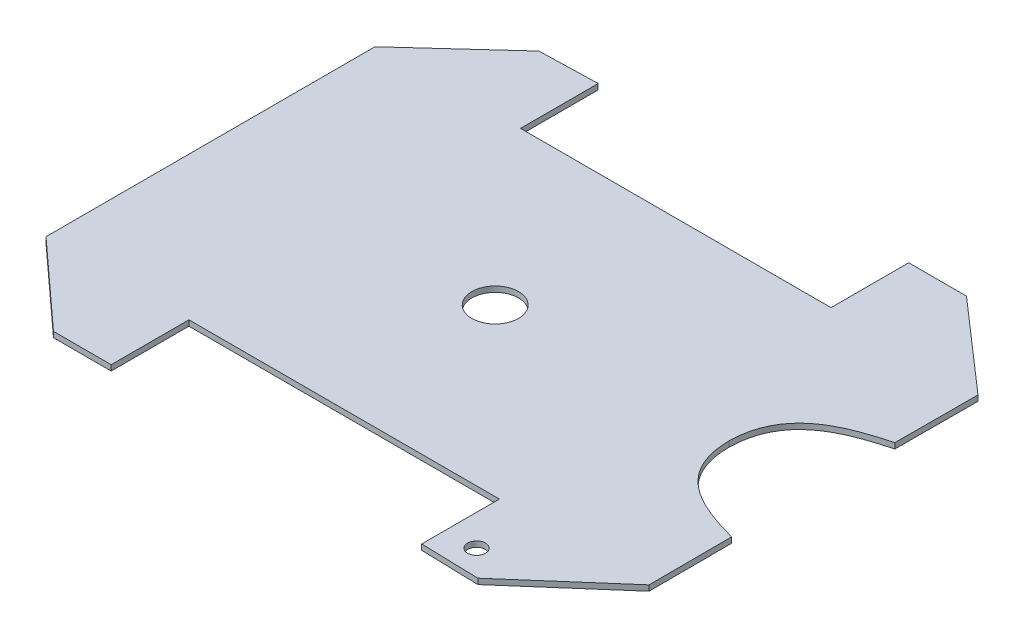
ISO-10303-21;
HEADER;
FILE_DESCRIPTION(('STEP AP214'),'2;1');
FILE_NAME('part.step','',(''),(''),'','','');
FILE_SCHEMA(('AUTOMOTIVE_DESIGN { 1 0 10303 214 1 1 1 1 }'));
ENDSEC;
DATA;
#1=APPLICATION_CONTEXT('core data for automotive mechanical design processes');
#2=APPLICATION_PROTOCOL_DEFINITION('international standard','automotive_design',2000,#1);
#3=PRODUCT_CONTEXT('',#1,'mechanical');
#4=PRODUCT('Part','Part','',(#3));
#5=PRODUCT_RELATED_PRODUCT_CATEGORY('part','',(#4));
#6=PRODUCT_DEFINITION_FORMATION('','',#4);
#7=PRODUCT_DEFINITION_CONTEXT('part definition',#1,'design');
#8=PRODUCT_DEFINITION('design','',#6,#7);
#9=PRODUCT_DEFINITION_SHAPE('','',#8);
#10=(LENGTH_UNIT() NAMED_UNIT(*) SI_UNIT(.MILLI.,.METRE.));
#11=(NAMED_UNIT(*) PLANE_ANGLE_UNIT() SI_UNIT($,.RADIAN.));
#12=(NAMED_UNIT(*) SI_UNIT($,.STERADIAN.) SOLID_ANGLE_UNIT());
#13=UNCERTAINTY_MEASURE_WITH_UNIT(LENGTH_MEASURE(1.E-05),#10,'distance_accuracy_value','');
#14=(GEOMETRIC_REPRESENTATION_CONTEXT(3) GLOBAL_UNCERTAINTY_ASSIGNED_CONTEXT((#13)) GLOBAL_UNIT_ASSIGNED_CONTEXT((#10,
#11,#12)) REPRESENTATION_CONTEXT('',''));
#15=CARTESIAN_POINT('',(0.,0.,0.));
#16=DIRECTION('',(0.,0.,1.));
#17=DIRECTION('',(1.,0.,0.));
#18=AXIS2_PLACEMENT_3D('',#15,#16,#17);
#19=CARTESIAN_POINT('',(273.101729513809,5.,148.382005757265));
#20=CARTESIAN_POINT('',(239.363891716756,5.,139.145872688841));
#21=CARTESIAN_POINT('',(197.437007814589,5.,125.423723422917));
#22=CARTESIAN_POINT('',(197.047353035714,5.,74.8747182026435));
#23=B_SPLINE_CURVE_WITH_KNOTS('',3,(#19,#20,#21,#22),.UNSPECIFIED.,.F.,.F.,(4,4),(0.,1.),.UNSPECIFIED.);
#24=DIRECTION('',(0.,-1.,0.));
#25=VECTOR('',#24,1.);
#26=SURFACE_OF_LINEAR_EXTRUSION('',#23,#25);
#27=CARTESIAN_POINT('',(273.101729513809,0.,148.382005757265));
#28=CARTESIAN_POINT('',(239.363891716756,0.,139.145872688841));
#29=CARTESIAN_POINT('',(197.437007814589,0.,125.423723422917));
#30=CARTESIAN_POINT('',(197.047353035714,0.,74.8747182026435));
#31=B_SPLINE_CURVE_WITH_KNOTS('',3,(#27,#28,#29,#30),.UNSPECIFIED.,.F.,.F.,(4,4),(0.,1.),.UNSPECIFIED.);
#32=CARTESIAN_POINT('',(273.101729513809,0.,148.382005757266));
#33=VERTEX_POINT('',#32);
#34=CARTESIAN_POINT('',(197.047353035714,0.,74.8747182026436));
#35=VERTEX_POINT('',#34);
#36=EDGE_CURVE('E195',#33,#35,#31,.T.);
#37=ORIENTED_EDGE('',*,*,#36,.T.);
#38=DIRECTION('',(0.,-1.,0.));
#39=VECTOR('',#38,1.);
#40=CARTESIAN_POINT('',(197.047353035714,5.,74.8747182026436));
#41=LINE('',#40,#39);
#42=CARTESIAN_POINT('',(197.047353035714,5.,74.8747182026436));
#43=VERTEX_POINT('',#42);
#44=EDGE_CURVE('E11',#43,#35,#41,.T.);
#45=ORIENTED_EDGE('',*,*,#44,.F.);
#46=CARTESIAN_POINT('',(273.101729513809,5.,148.382005757266));
#47=VERTEX_POINT('',#46);
#48=EDGE_CURVE('E242',#47,#43,#23,.T.);
#49=ORIENTED_EDGE('',*,*,#48,.F.);
#50=DIRECTION('',(0.,-1.,0.));
#51=VECTOR('',#50,1.);
#52=CARTESIAN_POINT('',(273.101729513809,5.,148.382005757266));
#53=LINE('',#52,#51);
#54=EDGE_CURVE('E191',#47,#33,#53,.T.);
#55=ORIENTED_EDGE('',*,*,#54,.T.);
#56=EDGE_LOOP('',(#37,#45,#49,#55));
#57=FACE_BOUND('',#56,.T.);
#58=ADVANCED_FACE('F32',(#57),#26,.F.);
#59=CARTESIAN_POINT('',(197.047353035714,5.,74.8747182026436));
#60=CARTESIAN_POINT('',(197.437007814589,5.,24.3257129823706));
#61=CARTESIAN_POINT('',(239.363891716756,5.,10.6035637164465));
#62=CARTESIAN_POINT('',(273.101729513809,5.,1.36743064802208));
#63=B_SPLINE_CURVE_WITH_KNOTS('',3,(#59,#60,#61,#62),.UNSPECIFIED.,.F.,.F.,(4,4),(0.,1.),.UNSPECIFIED.);
#64=DIRECTION('',(0.,-1.,0.));
#65=VECTOR('',#64,1.);
#66=SURFACE_OF_LINEAR_EXTRUSION('',#63,#65);
#67=CARTESIAN_POINT('',(197.047353035714,0.,74.8747182026436));
#68=CARTESIAN_POINT('',(197.437007814589,0.,24.3257129823706));
#69=CARTESIAN_POINT('',(239.363891716756,0.,10.6035637164465));
#70=CARTESIAN_POINT('',(273.101729513809,0.,1.36743064802208));
#71=B_SPLINE_CURVE_WITH_KNOTS('',3,(#67,#68,#69,#70),.UNSPECIFIED.,.F.,.F.,(4,4),(0.,1.),.UNSPECIFIED.);
#72=CARTESIAN_POINT('',(273.101729513809,0.,1.36743064802208));
#73=VERTEX_POINT('',#72);
#74=EDGE_CURVE('E200',#35,#73,#71,.T.);
#75=ORIENTED_EDGE('',*,*,#74,.T.);
#76=DIRECTION('',(0.,-1.,0.));
#77=VECTOR('',#76,1.);
#78=CARTESIAN_POINT('',(273.101729513809,5.,1.36743064802208));
#79=LINE('',#78,#77);
#80=CARTESIAN_POINT('',(273.101729513809,5.,1.36743064802208));
#81=VERTEX_POINT('',#80);
#82=EDGE_CURVE('E41',#81,#73,#79,.T.);
#83=ORIENTED_EDGE('',*,*,#82,.F.);
#84=EDGE_CURVE('E125',#43,#81,#63,.T.);
#85=ORIENTED_EDGE('',*,*,#84,.F.);
#86=ORIENTED_EDGE('',*,*,#44,.T.);
#87=EDGE_LOOP('',(#75,#83,#85,#86));
#88=FACE_BOUND('',#87,.T.);
#89=ADVANCED_FACE('F356',(#88),#66,.F.);
#90=CARTESIAN_POINT('',(273.341577688739,5.,-73.2625755728206));
#91=DIRECTION('',(-0.999994835687422,0.,-0.0032138136980613));
#92=DIRECTION('',(-0.0032138136980613,0.,0.999994835687422));
#93=AXIS2_PLACEMENT_3D('',#90,#91,#92);
#94=PLANE('',#93);
#95=DIRECTION('',(0.0032138136980613,0.,-0.999994835687422));
#96=VECTOR('',#95,1.);
#97=CARTESIAN_POINT('',(273.341577688739,0.,-73.2625755728206));
#98=LINE('',#97,#96);
#99=CARTESIAN_POINT('',(273.341577688739,0.,-73.2625755728206));
#100=VERTEX_POINT('',#99);
#101=EDGE_CURVE('E208',#73,#100,#98,.T.);
#102=ORIENTED_EDGE('',*,*,#101,.T.);
#103=DIRECTION('',(0.,-1.,0.));
#104=VECTOR('',#103,1.);
#105=CARTESIAN_POINT('',(273.341577688739,5.,-73.2625755728206));
#106=LINE('',#105,#104);
#107=CARTESIAN_POINT('',(273.341577688739,5.,-73.2625755728206));
#108=VERTEX_POINT('',#107);
#109=EDGE_CURVE('E282',#108,#100,#106,.T.);
#110=ORIENTED_EDGE('',*,*,#109,.F.);
#111=DIRECTION('',(0.0032138136980613,0.,-0.999994835687422));
#112=VECTOR('',#111,1.);
#113=CARTESIAN_POINT('',(273.341577688739,5.,-73.2625755728206));
#114=LINE('',#113,#112);
#115=EDGE_CURVE('E290',#81,#108,#114,.T.);
#116=ORIENTED_EDGE('',*,*,#115,.F.);
#117=ORIENTED_EDGE('',*,*,#82,.T.);
#118=EDGE_LOOP('',(#102,#110,#116,#117));
#119=FACE_BOUND('',#118,.T.);
#120=ADVANCED_FACE('F288',(#119),#94,.F.);
#121=CARTESIAN_POINT('',(273.341577688739,5.,-73.2625755728206));
#122=DIRECTION('',(-0.657933153115814,0.,0.753076334796867));
#123=DIRECTION('',(0.753076334796867,0.,0.657933153115814));
#124=AXIS2_PLACEMENT_3D('',#121,#122,#123);
#125=PLANE('',#124);
#126=DIRECTION('',(-0.753076334796867,0.,-0.657933153115814));
#127=VECTOR('',#126,1.);
#128=CARTESIAN_POINT('',(273.341577688739,0.,-73.2625755728206));
#129=LINE('',#128,#127);
#130=CARTESIAN_POINT('',(191.068300868454,0.,-145.141499307877));
#131=VERTEX_POINT('',#130);
#132=EDGE_CURVE('E213',#100,#131,#129,.T.);
#133=ORIENTED_EDGE('',*,*,#132,.T.);
#134=DIRECTION('',(0.,-1.,0.));
#135=VECTOR('',#134,1.);
#136=CARTESIAN_POINT('',(191.068300868454,5.,-145.141499307877));
#137=LINE('',#136,#135);
#138=CARTESIAN_POINT('',(191.068300868454,5.,-145.141499307877));
#139=VERTEX_POINT('',#138);
#140=EDGE_CURVE('E279',#139,#131,#137,.T.);
#141=ORIENTED_EDGE('',*,*,#140,.F.);
#142=DIRECTION('',(-0.753076334796867,0.,-0.657933153115814));
#143=VECTOR('',#142,1.);
#144=CARTESIAN_POINT('',(273.341577688739,5.,-73.2625755728206));
#145=LINE('',#144,#143);
#146=EDGE_CURVE('E308',#108,#139,#145,.T.);
#147=ORIENTED_EDGE('',*,*,#146,.F.);
#148=ORIENTED_EDGE('',*,*,#109,.T.);
#149=EDGE_LOOP('',(#133,#141,#147,#148));
#150=FACE_BOUND('',#149,.T.);
#151=ADVANCED_FACE('F299',(#150),#125,.F.);
#152=CARTESIAN_POINT('',(139.068300868454,5.,-145.141499307877));
#153=DIRECTION('',(0.,0.,1.));
#154=DIRECTION('',(1.,0.,0.));
#155=AXIS2_PLACEMENT_3D('',#152,#153,#154);
#156=PLANE('',#155);
#157=DIRECTION('',(-1.,0.,0.));
#158=VECTOR('',#157,1.);
#159=CARTESIAN_POINT('',(139.068300868454,0.,-145.141499307877));
#160=LINE('',#159,#158);
#161=CARTESIAN_POINT('',(139.068300868454,0.,-145.141499307877));
#162=VERTEX_POINT('',#161);
#163=EDGE_CURVE('E215',#131,#162,#160,.T.);
#164=ORIENTED_EDGE('',*,*,#163,.T.);
#165=DIRECTION('',(0.,-1.,0.));
#166=VECTOR('',#165,1.);
#167=CARTESIAN_POINT('',(139.068300868454,5.,-145.141499307877));
#168=LINE('',#167,#166);
#169=CARTESIAN_POINT('',(139.068300868454,5.,-145.141499307877));
#170=VERTEX_POINT('',#169);
#171=EDGE_CURVE('E276',#170,#162,#168,.T.);
#172=ORIENTED_EDGE('',*,*,#171,.F.);
#173=DIRECTION('',(-1.,0.,0.));
#174=VECTOR('',#173,1.);
#175=CARTESIAN_POINT('',(139.068300868454,5.,-145.141499307877));
#176=LINE('',#175,#174);
#177=EDGE_CURVE('E305',#139,#170,#176,.T.);
#178=ORIENTED_EDGE('',*,*,#177,.F.);
#179=ORIENTED_EDGE('',*,*,#140,.T.);
#180=EDGE_LOOP('',(#164,#172,#178,#179));
#181=FACE_BOUND('',#180,.T.);
#182=ADVANCED_FACE('F303',(#181),#156,.F.);
#183=CARTESIAN_POINT('',(139.068300868454,5.,-75.1414993078773));
#184=DIRECTION('',(1.,0.,0.));
#185=DIRECTION('',(0.,0.,-1.));
#186=AXIS2_PLACEMENT_3D('',#183,#184,#185);
#187=PLANE('',#186);
#188=DIRECTION('',(0.,0.,1.));
#189=VECTOR('',#188,1.);
#190=CARTESIAN_POINT('',(139.068300868454,0.,-75.1414993078773));
#191=LINE('',#190,#189);
#192=CARTESIAN_POINT('',(139.068300868454,0.,-75.1414993078773));
#193=VERTEX_POINT('',#192);
#194=EDGE_CURVE('E217',#162,#193,#191,.T.);
#195=ORIENTED_EDGE('',*,*,#194,.T.);
#196=DIRECTION('',(0.,-1.,0.));
#197=VECTOR('',#196,1.);
#198=CARTESIAN_POINT('',(139.068300868454,5.,-75.1414993078773));
#199=LINE('',#198,#197);
#200=CARTESIAN_POINT('',(139.068300868454,5.,-75.1414993078773));
#201=VERTEX_POINT('',#200);
#202=EDGE_CURVE('E273',#201,#193,#199,.T.);
#203=ORIENTED_EDGE('',*,*,#202,.F.);
#204=DIRECTION('',(0.,0.,1.));
#205=VECTOR('',#204,1.);
#206=CARTESIAN_POINT('',(139.068300868454,5.,-75.1414993078773));
#207=LINE('',#206,#205);
#208=EDGE_CURVE('E307',#170,#201,#207,.T.);
#209=ORIENTED_EDGE('',*,*,#208,.F.);
#210=ORIENTED_EDGE('',*,*,#171,.T.);
#211=EDGE_LOOP('',(#195,#203,#209,#210));
#212=FACE_BOUND('',#211,.T.);
#213=ADVANCED_FACE('F535',(#212),#187,.F.);
#214=CARTESIAN_POINT('',(-140.586469874335,5.,-75.1414993078773));
#215=DIRECTION('',(0.,0.,1.));
#216=DIRECTION('',(1.,0.,0.));
#217=AXIS2_PLACEMENT_3D('',#214,#215,#216);
#218=PLANE('',#217);
#219=DIRECTION('',(-1.,0.,0.));
#220=VECTOR('',#219,1.);
#221=CARTESIAN_POINT('',(-140.586469874335,0.,-75.1414993078773));
#222=LINE('',#221,#220);
#223=CARTESIAN_POINT('',(-140.586469874335,0.,-75.1414993078773));
#224=VERTEX_POINT('',#223);
#225=EDGE_CURVE('E219',#193,#224,#222,.T.);
#226=ORIENTED_EDGE('',*,*,#225,.T.);
#227=DIRECTION('',(0.,-1.,0.));
#228=VECTOR('',#227,1.);
#229=CARTESIAN_POINT('',(-140.586469874335,5.,-75.1414993078773));
#230=LINE('',#229,#228);
#231=CARTESIAN_POINT('',(-140.586469874335,5.,-75.1414993078773));
#232=VERTEX_POINT('',#231);
#233=EDGE_CURVE('E270',#232,#224,#230,.T.);
#234=ORIENTED_EDGE('',*,*,#233,.F.);
#235=DIRECTION('',(-1.,0.,0.));
#236=VECTOR('',#235,1.);
#237=CARTESIAN_POINT('',(-140.586469874335,5.,-75.1414993078773));
#238=LINE('',#237,#236);
#239=EDGE_CURVE('E310',#201,#232,#238,.T.);
#240=ORIENTED_EDGE('',*,*,#239,.F.);
#241=ORIENTED_EDGE('',*,*,#202,.T.);
#242=EDGE_LOOP('',(#226,#234,#240,#241));
#243=FACE_BOUND('',#242,.T.);
#244=ADVANCED_FACE('F525',(#243),#218,.F.);
#245=CARTESIAN_POINT('',(-140.586469874335,5.,-75.1414993078773));
#246=DIRECTION('',(-1.,0.,0.));
#247=DIRECTION('',(0.,0.,1.));
#248=AXIS2_PLACEMENT_3D('',#245,#246,#247);
#249=PLANE('',#248);
#250=DIRECTION('',(0.,0.,-1.));
#251=VECTOR('',#250,1.);
#252=CARTESIAN_POINT('',(-140.586469874335,0.,-75.1414993078773));
#253=LINE('',#252,#251);
#254=CARTESIAN_POINT('',(-140.586469874335,0.,-145.141499307877));
#255=VERTEX_POINT('',#254);
#256=EDGE_CURVE('E221',#224,#255,#253,.T.);
#257=ORIENTED_EDGE('',*,*,#256,.T.);
#258=DIRECTION('',(0.,-1.,0.));
#259=VECTOR('',#258,1.);
#260=CARTESIAN_POINT('',(-140.586469874335,5.,-145.141499307877));
#261=LINE('',#260,#259);
#262=CARTESIAN_POINT('',(-140.586469874335,5.,-145.141499307877));
#263=VERTEX_POINT('',#262);
#264=EDGE_CURVE('E267',#263,#255,#261,.T.);
#265=ORIENTED_EDGE('',*,*,#264,.F.);
#266=DIRECTION('',(0.,0.,-1.));
#267=VECTOR('',#266,1.);
#268=CARTESIAN_POINT('',(-140.586469874335,5.,-75.1414993078773));
#269=LINE('',#268,#267);
#270=EDGE_CURVE('E316',#232,#263,#269,.T.);
#271=ORIENTED_EDGE('',*,*,#270,.F.);
#272=ORIENTED_EDGE('',*,*,#233,.T.);
#273=EDGE_LOOP('',(#257,#265,#271,#272));
#274=FACE_BOUND('',#273,.T.);
#275=ADVANCED_FACE('F515',(#274),#249,.F.);
#276=CARTESIAN_POINT('',(-140.586469874335,5.,-145.141499307877));
#277=DIRECTION('',(0.026876926913342,0.,0.99963875014912));
#278=DIRECTION('',(0.99963875014912,0.,-0.026876926913342));
#279=AXIS2_PLACEMENT_3D('',#276,#277,#278);
#280=PLANE('',#279);
#281=DIRECTION('',(-0.99963875014912,0.,0.0268769269133419));
#282=VECTOR('',#281,1.);
#283=CARTESIAN_POINT('',(-140.586469874335,0.,-145.141499307877));
#284=LINE('',#283,#282);
#285=CARTESIAN_POINT('',(-192.586469874335,0.,-143.743394043065));
#286=VERTEX_POINT('',#285);
#287=EDGE_CURVE('E223',#255,#286,#284,.T.);
#288=ORIENTED_EDGE('',*,*,#287,.T.);
#289=DIRECTION('',(0.,-1.,0.));
#290=VECTOR('',#289,1.);
#291=CARTESIAN_POINT('',(-192.586469874335,5.,-143.743394043065));
#292=LINE('',#291,#290);
#293=CARTESIAN_POINT('',(-192.586469874335,5.,-143.743394043065));
#294=VERTEX_POINT('',#293);
#295=EDGE_CURVE('E264',#294,#286,#292,.T.);
#296=ORIENTED_EDGE('',*,*,#295,.F.);
#297=DIRECTION('',(-0.99963875014912,0.,0.0268769269133419));
#298=VECTOR('',#297,1.);
#299=CARTESIAN_POINT('',(-140.586469874335,5.,-145.141499307877));
#300=LINE('',#299,#298);
#301=EDGE_CURVE('E318',#263,#294,#300,.T.);
#302=ORIENTED_EDGE('',*,*,#301,.F.);
#303=ORIENTED_EDGE('',*,*,#264,.T.);
#304=EDGE_LOOP('',(#288,#296,#302,#303));
#305=FACE_BOUND('',#304,.T.);
#306=ADVANCED_FACE('F505',(#305),#280,.F.);
#307=CARTESIAN_POINT('',(-269.792181600452,5.,-73.2625755728205));
#308=DIRECTION('',(0.674210134413066,0.,0.738539568780655));
#309=DIRECTION('',(0.738539568780655,0.,-0.674210134413066));
#310=AXIS2_PLACEMENT_3D('',#307,#308,#309);
#311=PLANE('',#310);
#312=DIRECTION('',(-0.738539568780655,0.,0.674210134413066));
#313=VECTOR('',#312,1.);
#314=CARTESIAN_POINT('',(-269.792181600452,0.,-73.2625755728205));
#315=LINE('',#314,#313);
#316=CARTESIAN_POINT('',(-269.792181600452,0.,-73.2625755728205));
#317=VERTEX_POINT('',#316);
#318=EDGE_CURVE('E225',#286,#317,#315,.T.);
#319=ORIENTED_EDGE('',*,*,#318,.T.);
#320=DIRECTION('',(0.,-1.,0.));
#321=VECTOR('',#320,1.);
#322=CARTESIAN_POINT('',(-269.792181600452,5.,-73.2625755728205));
#323=LINE('',#322,#321);
#324=CARTESIAN_POINT('',(-269.792181600452,5.,-73.2625755728205));
#325=VERTEX_POINT('',#324);
#326=EDGE_CURVE('E261',#325,#317,#323,.T.);
#327=ORIENTED_EDGE('',*,*,#326,.F.);
#328=DIRECTION('',(-0.738539568780655,0.,0.674210134413066));
#329=VECTOR('',#328,1.);
#330=CARTESIAN_POINT('',(-269.792181600452,5.,-73.2625755728205));
#331=LINE('',#330,#329);
#332=EDGE_CURVE('E320',#294,#325,#331,.T.);
#333=ORIENTED_EDGE('',*,*,#332,.F.);
#334=ORIENTED_EDGE('',*,*,#295,.T.);
#335=EDGE_LOOP('',(#319,#327,#333,#334));
#336=FACE_BOUND('',#335,.T.);
#337=ADVANCED_FACE('F495',(#336),#311,.F.);
#338=CARTESIAN_POINT('',(-269.792181600452,5.,-73.2625755728205));
#339=DIRECTION('',(1.,0.,0.));
#340=DIRECTION('',(0.,0.,-1.));
#341=AXIS2_PLACEMENT_3D('',#338,#339,#340);
#342=PLANE('',#341);
#343=DIRECTION('',(0.,0.,1.));
#344=VECTOR('',#343,1.);
#345=CARTESIAN_POINT('',(-269.792181600452,0.,-73.2625755728205));
#346=LINE('',#345,#344);
#347=CARTESIAN_POINT('',(-269.792181600452,0.,223.012011978108));
#348=VERTEX_POINT('',#347);
#349=EDGE_CURVE('E227',#317,#348,#346,.T.);
#350=ORIENTED_EDGE('',*,*,#349,.T.);
#351=DIRECTION('',(0.,-1.,0.));
#352=VECTOR('',#351,1.);
#353=CARTESIAN_POINT('',(-269.792181600452,5.,223.012011978108));
#354=LINE('',#353,#352);
#355=CARTESIAN_POINT('',(-269.792181600452,5.,223.012011978108));
#356=VERTEX_POINT('',#355);
#357=EDGE_CURVE('E258',#356,#348,#354,.T.);
#358=ORIENTED_EDGE('',*,*,#357,.F.);
#359=DIRECTION('',(0.,0.,1.));
#360=VECTOR('',#359,1.);
#361=CARTESIAN_POINT('',(-269.792181600452,5.,-73.2625755728205));
#362=LINE('',#361,#360);
#363=EDGE_CURVE('E322',#325,#356,#362,.T.);
#364=ORIENTED_EDGE('',*,*,#363,.F.);
#365=ORIENTED_EDGE('',*,*,#326,.T.);
#366=EDGE_LOOP('',(#350,#358,#364,#365));
#367=FACE_BOUND('',#366,.T.);
#368=ADVANCED_FACE('F485',(#367),#342,.F.);
#369=CARTESIAN_POINT('',(-269.792181600452,5.,223.012011978108));
#370=DIRECTION('',(0.674210134413065,0.,-0.738539568780655));
#371=DIRECTION('',(-0.738539568780655,0.,-0.674210134413065));
#372=AXIS2_PLACEMENT_3D('',#369,#370,#371);
#373=PLANE('',#372);
#374=DIRECTION('',(0.738539568780655,0.,0.674210134413065));
#375=VECTOR('',#374,1.);
#376=CARTESIAN_POINT('',(-269.792181600452,0.,223.012011978108));
#377=LINE('',#376,#375);
#378=CARTESIAN_POINT('',(-192.586469874335,0.,293.492830448352));
#379=VERTEX_POINT('',#378);
#380=EDGE_CURVE('E229',#348,#379,#377,.T.);
#381=ORIENTED_EDGE('',*,*,#380,.T.);
#382=DIRECTION('',(0.,-1.,0.));
#383=VECTOR('',#382,1.);
#384=CARTESIAN_POINT('',(-192.586469874335,5.,293.492830448352));
#385=LINE('',#384,#383);
#386=CARTESIAN_POINT('',(-192.586469874335,5.,293.492830448352));
#387=VERTEX_POINT('',#386);
#388=EDGE_CURVE('E255',#387,#379,#385,.T.);
#389=ORIENTED_EDGE('',*,*,#388,.F.);
#390=DIRECTION('',(0.738539568780655,0.,0.674210134413065));
#391=VECTOR('',#390,1.);
#392=CARTESIAN_POINT('',(-269.792181600452,5.,223.012011978108));
#393=LINE('',#392,#391);
#394=EDGE_CURVE('E324',#356,#387,#393,.T.);
#395=ORIENTED_EDGE('',*,*,#394,.F.);
#396=ORIENTED_EDGE('',*,*,#357,.T.);
#397=EDGE_LOOP('',(#381,#389,#395,#396));
#398=FACE_BOUND('',#397,.T.);
#399=ADVANCED_FACE('F475',(#398),#373,.F.);
#400=CARTESIAN_POINT('',(-140.586469874335,5.,293.492830448352));
#401=DIRECTION('',(0.,0.,-1.));
#402=DIRECTION('',(-1.,0.,0.));
#403=AXIS2_PLACEMENT_3D('',#400,#401,#402);
#404=PLANE('',#403);
#405=DIRECTION('',(1.,0.,0.));
#406=VECTOR('',#405,1.);
#407=CARTESIAN_POINT('',(-140.586469874335,0.,293.492830448352));
#408=LINE('',#407,#406);
#409=CARTESIAN_POINT('',(-140.586469874335,0.,293.492830448352));
#410=VERTEX_POINT('',#409);
#411=EDGE_CURVE('E231',#379,#410,#408,.T.);
#412=ORIENTED_EDGE('',*,*,#411,.T.);
#413=DIRECTION('',(0.,-1.,0.));
#414=VECTOR('',#413,1.);
#415=CARTESIAN_POINT('',(-140.586469874335,5.,293.492830448352));
#416=LINE('',#415,#414);
#417=CARTESIAN_POINT('',(-140.586469874335,5.,293.492830448352));
#418=VERTEX_POINT('',#417);
#419=EDGE_CURVE('E252',#418,#410,#416,.T.);
#420=ORIENTED_EDGE('',*,*,#419,.F.);
#421=DIRECTION('',(1.,0.,0.));
#422=VECTOR('',#421,1.);
#423=CARTESIAN_POINT('',(-140.586469874335,5.,293.492830448352));
#424=LINE('',#423,#422);
#425=EDGE_CURVE('E326',#387,#418,#424,.T.);
#426=ORIENTED_EDGE('',*,*,#425,.F.);
#427=ORIENTED_EDGE('',*,*,#388,.T.);
#428=EDGE_LOOP('',(#412,#420,#426,#427));
#429=FACE_BOUND('',#428,.T.);
#430=ADVANCED_FACE('F465',(#429),#404,.F.);
#431=CARTESIAN_POINT('',(-140.586469874335,5.,223.492830448352));
#432=DIRECTION('',(-1.,0.,0.));
#433=DIRECTION('',(0.,0.,1.));
#434=AXIS2_PLACEMENT_3D('',#431,#432,#433);
#435=PLANE('',#434);
#436=DIRECTION('',(0.,0.,-1.));
#437=VECTOR('',#436,1.);
#438=CARTESIAN_POINT('',(-140.586469874335,0.,223.492830448352));
#439=LINE('',#438,#437);
#440=CARTESIAN_POINT('',(-140.586469874335,0.,223.492830448352));
#441=VERTEX_POINT('',#440);
#442=EDGE_CURVE('E233',#410,#441,#439,.T.);
#443=ORIENTED_EDGE('',*,*,#442,.T.);
#444=DIRECTION('',(0.,-1.,0.));
#445=VECTOR('',#444,1.);
#446=CARTESIAN_POINT('',(-140.586469874335,5.,223.492830448352));
#447=LINE('',#446,#445);
#448=CARTESIAN_POINT('',(-140.586469874335,5.,223.492830448352));
#449=VERTEX_POINT('',#448);
#450=EDGE_CURVE('E249',#449,#441,#447,.T.);
#451=ORIENTED_EDGE('',*,*,#450,.F.);
#452=DIRECTION('',(0.,0.,-1.));
#453=VECTOR('',#452,1.);
#454=CARTESIAN_POINT('',(-140.586469874335,5.,223.492830448352));
#455=LINE('',#454,#453);
#456=EDGE_CURVE('E328',#418,#449,#455,.T.);
#457=ORIENTED_EDGE('',*,*,#456,.F.);
#458=ORIENTED_EDGE('',*,*,#419,.T.);
#459=EDGE_LOOP('',(#443,#451,#457,#458));
#460=FACE_BOUND('',#459,.T.);
#461=ADVANCED_FACE('F456',(#460),#435,.F.);
#462=CARTESIAN_POINT('',(-140.586469874335,5.,223.492830448352));
#463=DIRECTION('',(0.,0.,-1.));
#464=DIRECTION('',(-1.,0.,0.));
#465=AXIS2_PLACEMENT_3D('',#462,#463,#464);
#466=PLANE('',#465);
#467=DIRECTION('',(1.,0.,0.));
#468=VECTOR('',#467,1.);
#469=CARTESIAN_POINT('',(-140.586469874335,0.,223.492830448352));
#470=LINE('',#469,#468);
#471=CARTESIAN_POINT('',(139.068300868454,0.,223.492830448352));
#472=VERTEX_POINT('',#471);
#473=EDGE_CURVE('E235',#441,#472,#470,.T.);
#474=ORIENTED_EDGE('',*,*,#473,.T.);
#475=DIRECTION('',(0.,-1.,0.));
#476=VECTOR('',#475,1.);
#477=CARTESIAN_POINT('',(139.068300868454,5.,223.492830448352));
#478=LINE('',#477,#476);
#479=CARTESIAN_POINT('',(139.068300868454,5.,223.492830448352));
#480=VERTEX_POINT('',#479);
#481=EDGE_CURVE('E246',#480,#472,#478,.T.);
#482=ORIENTED_EDGE('',*,*,#481,.F.);
#483=DIRECTION('',(1.,0.,0.));
#484=VECTOR('',#483,1.);
#485=CARTESIAN_POINT('',(-140.586469874335,5.,223.492830448352));
#486=LINE('',#485,#484);
#487=EDGE_CURVE('E330',#449,#480,#486,.T.);
#488=ORIENTED_EDGE('',*,*,#487,.F.);
#489=ORIENTED_EDGE('',*,*,#450,.T.);
#490=EDGE_LOOP('',(#474,#482,#488,#489));
#491=FACE_BOUND('',#490,.T.);
#492=ADVANCED_FACE('F336',(#491),#466,.F.);
#493=CARTESIAN_POINT('',(139.068300868454,5.,223.492830448352));
#494=DIRECTION('',(1.,0.,0.));
#495=DIRECTION('',(0.,0.,-1.));
#496=AXIS2_PLACEMENT_3D('',#493,#494,#495);
#497=PLANE('',#496);
#498=DIRECTION('',(0.,0.,1.));
#499=VECTOR('',#498,1.);
#500=CARTESIAN_POINT('',(139.068300868454,0.,223.492830448352));
#501=LINE('',#500,#499);
#502=CARTESIAN_POINT('',(139.068300868454,0.,293.492830448352));
#503=VERTEX_POINT('',#502);
#504=EDGE_CURVE('E237',#472,#503,#501,.T.);
#505=ORIENTED_EDGE('',*,*,#504,.T.);
#506=DIRECTION('',(0.,-1.,0.));
#507=VECTOR('',#506,1.);
#508=CARTESIAN_POINT('',(139.068300868454,5.,293.492830448352));
#509=LINE('',#508,#507);
#510=CARTESIAN_POINT('',(139.068300868454,5.,293.492830448352));
#511=VERTEX_POINT('',#510);
#512=EDGE_CURVE('E186',#511,#503,#509,.T.);
#513=ORIENTED_EDGE('',*,*,#512,.F.);
#514=DIRECTION('',(0.,0.,1.));
#515=VECTOR('',#514,1.);
#516=CARTESIAN_POINT('',(139.068300868454,5.,223.492830448352));
#517=LINE('',#516,#515);
#518=EDGE_CURVE('E177',#480,#511,#517,.T.);
#519=ORIENTED_EDGE('',*,*,#518,.F.);
#520=ORIENTED_EDGE('',*,*,#481,.T.);
#521=EDGE_LOOP('',(#505,#513,#519,#520));
#522=FACE_BOUND('',#521,.T.);
#523=ADVANCED_FACE('F340',(#522),#497,.F.);
#524=CARTESIAN_POINT('',(139.068300868454,5.,293.492830448352));
#525=DIRECTION('',(0.0268769269133441,0.,-0.99963875014912));
#526=DIRECTION('',(-0.99963875014912,0.,-0.0268769269133441));
#527=AXIS2_PLACEMENT_3D('',#524,#525,#526);
#528=PLANE('',#527);
#529=DIRECTION('',(0.99963875014912,0.,0.0268769269133441));
#530=VECTOR('',#529,1.);
#531=CARTESIAN_POINT('',(139.068300868454,0.,293.492830448352));
#532=LINE('',#531,#530);
#533=CARTESIAN_POINT('',(191.068300868454,0.,294.890935713164));
#534=VERTEX_POINT('',#533);
#535=EDGE_CURVE('E185',#503,#534,#532,.T.);
#536=ORIENTED_EDGE('',*,*,#535,.T.);
#537=DIRECTION('',(0.,-1.,0.));
#538=VECTOR('',#537,1.);
#539=CARTESIAN_POINT('',(191.068300868454,5.,294.890935713164));
#540=LINE('',#539,#538);
#541=CARTESIAN_POINT('',(191.068300868454,5.,294.890935713164));
#542=VERTEX_POINT('',#541);
#543=EDGE_CURVE('E182',#542,#534,#540,.T.);
#544=ORIENTED_EDGE('',*,*,#543,.F.);
#545=DIRECTION('',(0.99963875014912,0.,0.0268769269133441));
#546=VECTOR('',#545,1.);
#547=CARTESIAN_POINT('',(139.068300868454,5.,293.492830448352));
#548=LINE('',#547,#546);
#549=EDGE_CURVE('E171',#511,#542,#548,.T.);
#550=ORIENTED_EDGE('',*,*,#549,.F.);
#551=ORIENTED_EDGE('',*,*,#512,.T.);
#552=EDGE_LOOP('',(#536,#544,#550,#551));
#553=FACE_BOUND('',#552,.T.);
#554=ADVANCED_FACE('F183',(#553),#528,.F.);
#555=CARTESIAN_POINT('',(273.341577688739,5.,223.012011978108));
#556=DIRECTION('',(-0.657933153115814,0.,-0.753076334796867));
#557=DIRECTION('',(-0.753076334796867,0.,0.657933153115814));
#558=AXIS2_PLACEMENT_3D('',#555,#556,#557);
#559=PLANE('',#558);
#560=DIRECTION('',(0.753076334796867,0.,-0.657933153115814));
#561=VECTOR('',#560,1.);
#562=CARTESIAN_POINT('',(273.341577688739,0.,223.012011978108));
#563=LINE('',#562,#561);
#564=CARTESIAN_POINT('',(273.341577688739,0.,223.012011978108));
#565=VERTEX_POINT('',#564);
#566=EDGE_CURVE('E111',#534,#565,#563,.T.);
#567=ORIENTED_EDGE('',*,*,#566,.T.);
#568=DIRECTION('',(0.,-1.,0.));
#569=VECTOR('',#568,1.);
#570=CARTESIAN_POINT('',(273.341577688739,5.,223.012011978108));
#571=LINE('',#570,#569);
#572=CARTESIAN_POINT('',(273.341577688739,5.,223.012011978108));
#573=VERTEX_POINT('',#572);
#574=EDGE_CURVE('E187',#573,#565,#571,.T.);
#575=ORIENTED_EDGE('',*,*,#574,.F.);
#576=DIRECTION('',(0.753076334796867,0.,-0.657933153115814));
#577=VECTOR('',#576,1.);
#578=CARTESIAN_POINT('',(273.341577688739,5.,223.012011978108));
#579=LINE('',#578,#577);
#580=EDGE_CURVE('E175',#542,#573,#579,.T.);
#581=ORIENTED_EDGE('',*,*,#580,.F.);
#582=ORIENTED_EDGE('',*,*,#543,.T.);
#583=EDGE_LOOP('',(#567,#575,#581,#582));
#584=FACE_BOUND('',#583,.T.);
#585=ADVANCED_FACE('F189',(#584),#559,.F.);
#586=CARTESIAN_POINT('',(273.341577688739,5.,223.012011978108));
#587=DIRECTION('',(-0.999994835687422,0.,0.00321381369805613));
#588=DIRECTION('',(0.00321381369805613,0.,0.999994835687422));
#589=AXIS2_PLACEMENT_3D('',#586,#587,#588);
#590=PLANE('',#589);
#591=DIRECTION('',(-0.00321381369805613,0.,-0.999994835687422));
#592=VECTOR('',#591,1.);
#593=CARTESIAN_POINT('',(273.341577688739,0.,223.012011978108));
#594=LINE('',#593,#592);
#595=EDGE_CURVE('E117',#565,#33,#594,.T.);
#596=ORIENTED_EDGE('',*,*,#595,.T.);
#597=ORIENTED_EDGE('',*,*,#54,.F.);
#598=DIRECTION('',(-0.00321381369805613,0.,-0.999994835687422));
#599=VECTOR('',#598,1.);
#600=CARTESIAN_POINT('',(273.341577688739,5.,223.012011978108));
#601=LINE('',#600,#599);
#602=EDGE_CURVE('E49',#573,#47,#601,.T.);
#603=ORIENTED_EDGE('',*,*,#602,.F.);
#604=ORIENTED_EDGE('',*,*,#574,.T.);
#605=EDGE_LOOP('',(#596,#597,#603,#604));
#606=FACE_BOUND('',#605,.T.);
#607=ADVANCED_FACE('F344',(#606),#590,.F.);
#608=CARTESIAN_POINT('',(222.568972642945,5.,127.120689036898));
#609=DIRECTION('',(0.,1.,0.));
#610=DIRECTION('',(0.,0.,1.));
#611=AXIS2_PLACEMENT_3D('',#608,#609,#610);
#612=PLANE('',#611);
#613=CARTESIAN_POINT('',(167.052967515773,5.,272.065876513803));
#614=DIRECTION('',(0.,1.,0.));
#615=DIRECTION('',(0.,0.,1.));
#616=AXIS2_PLACEMENT_3D('',#613,#614,#615);
#617=CIRCLE('',#616,8.00000000000001);
#618=CARTESIAN_POINT('',(167.052967515773,5.,280.065876513803));
#619=VERTEX_POINT('',#618);
#620=EDGE_CURVE('E385',#619,#619,#617,.T.);
#621=ORIENTED_EDGE('',*,*,#620,.F.);
#622=EDGE_LOOP('',(#621));
#623=FACE_BOUND('',#622,.T.);
#624=CARTESIAN_POINT('',(-14.2299509116979,5.,74.0266572541699));
#625=DIRECTION('',(0.,1.,0.));
#626=DIRECTION('',(0.,0.,1.));
#627=AXIS2_PLACEMENT_3D('',#624,#625,#626);
#628=CIRCLE('',#627,21.);
#629=CARTESIAN_POINT('',(-14.2299509116979,5.,95.0266572541699));
#630=VERTEX_POINT('',#629);
#631=EDGE_CURVE('E376',#630,#630,#628,.T.);
#632=ORIENTED_EDGE('',*,*,#631,.F.);
#633=EDGE_LOOP('',(#632));
#634=FACE_BOUND('',#633,.T.);
#635=ORIENTED_EDGE('',*,*,#48,.T.);
#636=ORIENTED_EDGE('',*,*,#84,.T.);
#637=ORIENTED_EDGE('',*,*,#115,.T.);
#638=ORIENTED_EDGE('',*,*,#146,.T.);
#639=ORIENTED_EDGE('',*,*,#177,.T.);
#640=ORIENTED_EDGE('',*,*,#208,.T.);
#641=ORIENTED_EDGE('',*,*,#239,.T.);
#642=ORIENTED_EDGE('',*,*,#270,.T.);
#643=ORIENTED_EDGE('',*,*,#301,.T.);
#644=ORIENTED_EDGE('',*,*,#332,.T.);
#645=ORIENTED_EDGE('',*,*,#363,.T.);
#646=ORIENTED_EDGE('',*,*,#394,.T.);
#647=ORIENTED_EDGE('',*,*,#425,.T.);
#648=ORIENTED_EDGE('',*,*,#456,.T.);
#649=ORIENTED_EDGE('',*,*,#487,.T.);
#650=ORIENTED_EDGE('',*,*,#518,.T.);
#651=ORIENTED_EDGE('',*,*,#549,.T.);
#652=ORIENTED_EDGE('',*,*,#580,.T.);
#653=ORIENTED_EDGE('',*,*,#602,.T.);
#654=EDGE_LOOP('',(#635,#636,#637,#638,#639,#640,#641,#642,#643,#644,#645,#646,#647,#648,#649,
#650,#651,#652,#653));
#655=FACE_BOUND('',#654,.T.);
#656=ADVANCED_FACE('F173',(#623,#634,#655),#612,.T.);
#657=CARTESIAN_POINT('',(222.568972642945,0.,127.120689036898));
#658=DIRECTION('',(0.,1.,0.));
#659=DIRECTION('',(0.,0.,1.));
#660=AXIS2_PLACEMENT_3D('',#657,#658,#659);
#661=PLANE('',#660);
#662=CARTESIAN_POINT('',(167.052967515773,0.,272.065876513803));
#663=DIRECTION('',(0.,1.,0.));
#664=DIRECTION('',(0.,0.,1.));
#665=AXIS2_PLACEMENT_3D('',#662,#663,#664);
#666=CIRCLE('',#665,8.00000000000001);
#667=CARTESIAN_POINT('',(167.052967515773,0.,280.065876513803));
#668=VERTEX_POINT('',#667);
#669=EDGE_CURVE('E382',#668,#668,#666,.T.);
#670=ORIENTED_EDGE('',*,*,#669,.T.);
#671=EDGE_LOOP('',(#670));
#672=FACE_BOUND('',#671,.T.);
#673=CARTESIAN_POINT('',(-14.2299509116979,0.,74.0266572541699));
#674=DIRECTION('',(0.,1.,0.));
#675=DIRECTION('',(0.,0.,1.));
#676=AXIS2_PLACEMENT_3D('',#673,#674,#675);
#677=CIRCLE('',#676,21.);
#678=CARTESIAN_POINT('',(-14.2299509116979,0.,95.0266572541699));
#679=VERTEX_POINT('',#678);
#680=EDGE_CURVE('E201',#679,#679,#677,.T.);
#681=ORIENTED_EDGE('',*,*,#680,.T.);
#682=EDGE_LOOP('',(#681));
#683=FACE_BOUND('',#682,.T.);
#684=ORIENTED_EDGE('',*,*,#36,.F.);
#685=ORIENTED_EDGE('',*,*,#595,.F.);
#686=ORIENTED_EDGE('',*,*,#566,.F.);
#687=ORIENTED_EDGE('',*,*,#535,.F.);
#688=ORIENTED_EDGE('',*,*,#504,.F.);
#689=ORIENTED_EDGE('',*,*,#473,.F.);
#690=ORIENTED_EDGE('',*,*,#442,.F.);
#691=ORIENTED_EDGE('',*,*,#411,.F.);
#692=ORIENTED_EDGE('',*,*,#380,.F.);
#693=ORIENTED_EDGE('',*,*,#349,.F.);
#694=ORIENTED_EDGE('',*,*,#318,.F.);
#695=ORIENTED_EDGE('',*,*,#287,.F.);
#696=ORIENTED_EDGE('',*,*,#256,.F.);
#697=ORIENTED_EDGE('',*,*,#225,.F.);
#698=ORIENTED_EDGE('',*,*,#194,.F.);
#699=ORIENTED_EDGE('',*,*,#163,.F.);
#700=ORIENTED_EDGE('',*,*,#132,.F.);
#701=ORIENTED_EDGE('',*,*,#101,.F.);
#702=ORIENTED_EDGE('',*,*,#74,.F.);
#703=EDGE_LOOP('',(#684,#685,#686,#687,#688,#689,#690,#691,#692,#693,#694,#695,#696,#697,#698,
#699,#700,#701,#702));
#704=FACE_BOUND('',#703,.T.);
#705=ADVANCED_FACE('F294',(#672,#683,#704),#661,.F.);
#706=CARTESIAN_POINT('',(-14.2299509116979,0.,74.0266572541699));
#707=DIRECTION('',(0.,1.,0.));
#708=DIRECTION('',(0.,0.,1.));
#709=AXIS2_PLACEMENT_3D('',#706,#707,#708);
#710=CYLINDRICAL_SURFACE('',#709,21.);
#711=ORIENTED_EDGE('',*,*,#680,.F.);
#712=EDGE_LOOP('',(#711));
#713=FACE_BOUND('',#712,.T.);
#714=ORIENTED_EDGE('',*,*,#631,.T.);
#715=EDGE_LOOP('',(#714));
#716=FACE_BOUND('',#715,.T.);
#717=ADVANCED_FACE('F396',(#713,#716),#710,.F.);
#718=CARTESIAN_POINT('',(167.052967515773,0.,272.065876513803));
#719=DIRECTION('',(0.,1.,0.));
#720=DIRECTION('',(0.,0.,1.));
#721=AXIS2_PLACEMENT_3D('',#718,#719,#720);
#722=CYLINDRICAL_SURFACE('',#721,8.00000000000001);
#723=ORIENTED_EDGE('',*,*,#669,.F.);
#724=EDGE_LOOP('',(#723));
#725=FACE_BOUND('',#724,.T.);
#726=ORIENTED_EDGE('',*,*,#620,.T.);
#727=EDGE_LOOP('',(#726));
#728=FACE_BOUND('',#727,.T.);
#729=ADVANCED_FACE('F393',(#725,#728),#722,.F.);
#730=CLOSED_SHELL('',(#58,#89,#120,#151,#182,#213,#244,#275,#306,#337,#368,#399,#430,#461,#492,
#523,#554,#585,#607,#656,#705,#717,#729));
#731=MANIFOLD_SOLID_BREP('B2',#730);
#732=ADVANCED_BREP_SHAPE_REPRESENTATION('',(#18,#731),#14);
#733=SHAPE_DEFINITION_REPRESENTATION(#9,#732);
ENDSEC;
END-ISO-10303-21;
